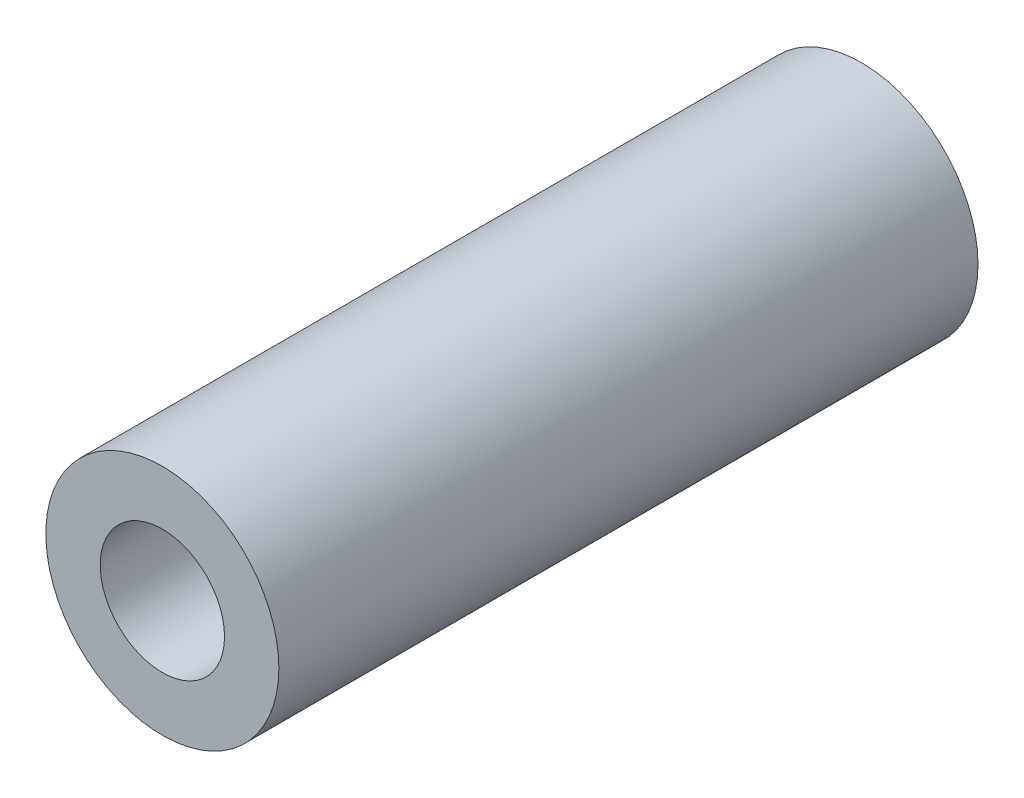
ISO-10303-21;
HEADER;
FILE_DESCRIPTION(('STEP AP214'),'2;1');
FILE_NAME('part.step','',(''),(''),'','','');
FILE_SCHEMA(('AUTOMOTIVE_DESIGN { 1 0 10303 214 1 1 1 1 }'));
ENDSEC;
DATA;
#1=APPLICATION_CONTEXT('core data for automotive mechanical design processes');
#2=APPLICATION_PROTOCOL_DEFINITION('international standard','automotive_design',2000,#1);
#3=PRODUCT_CONTEXT('',#1,'mechanical');
#4=PRODUCT('Part','Part','',(#3));
#5=PRODUCT_RELATED_PRODUCT_CATEGORY('part','',(#4));
#6=PRODUCT_DEFINITION_FORMATION('','',#4);
#7=PRODUCT_DEFINITION_CONTEXT('part definition',#1,'design');
#8=PRODUCT_DEFINITION('design','',#6,#7);
#9=PRODUCT_DEFINITION_SHAPE('','',#8);
#10=(LENGTH_UNIT() NAMED_UNIT(*) SI_UNIT(.MILLI.,.METRE.));
#11=(NAMED_UNIT(*) PLANE_ANGLE_UNIT() SI_UNIT($,.RADIAN.));
#12=(NAMED_UNIT(*) SI_UNIT($,.STERADIAN.) SOLID_ANGLE_UNIT());
#13=UNCERTAINTY_MEASURE_WITH_UNIT(LENGTH_MEASURE(1.E-05),#10,'distance_accuracy_value','');
#14=(GEOMETRIC_REPRESENTATION_CONTEXT(3) GLOBAL_UNCERTAINTY_ASSIGNED_CONTEXT((#13)) GLOBAL_UNIT_ASSIGNED_CONTEXT((#10,
#11,#12)) REPRESENTATION_CONTEXT('',''));
#15=CARTESIAN_POINT('',(0.,0.,0.));
#16=DIRECTION('',(0.,0.,1.));
#17=DIRECTION('',(1.,0.,0.));
#18=AXIS2_PLACEMENT_3D('',#15,#16,#17);
#19=CARTESIAN_POINT('',(0.,0.,18.));
#20=DIRECTION('',(0.,0.,1.));
#21=DIRECTION('',(1.,0.,0.));
#22=AXIS2_PLACEMENT_3D('',#19,#20,#21);
#23=PLANE('',#22);
#24=CARTESIAN_POINT('',(0.,0.,18.));
#25=DIRECTION('',(0.,0.,1.));
#26=DIRECTION('',(1.,0.,0.));
#27=AXIS2_PLACEMENT_3D('',#24,#25,#26);
#28=CIRCLE('',#27,3.);
#29=CARTESIAN_POINT('',(3.,0.,18.));
#30=VERTEX_POINT('',#29);
#31=EDGE_CURVE('E10',#30,#30,#28,.T.);
#32=ORIENTED_EDGE('',*,*,#31,.T.);
#33=EDGE_LOOP('',(#32));
#34=FACE_BOUND('',#33,.T.);
#35=CARTESIAN_POINT('',(0.,0.,18.));
#36=DIRECTION('',(0.,0.,1.));
#37=DIRECTION('',(1.,0.,0.));
#38=AXIS2_PLACEMENT_3D('',#35,#36,#37);
#39=CIRCLE('',#38,1.6);
#40=CARTESIAN_POINT('',(1.6,0.,18.));
#41=VERTEX_POINT('',#40);
#42=EDGE_CURVE('E45',#41,#41,#39,.T.);
#43=ORIENTED_EDGE('',*,*,#42,.F.);
#44=EDGE_LOOP('',(#43));
#45=FACE_BOUND('',#44,.T.);
#46=ADVANCED_FACE('F34',(#34,#45),#23,.T.);
#47=CARTESIAN_POINT('',(0.,0.,0.));
#48=DIRECTION('',(0.,0.,1.));
#49=DIRECTION('',(1.,0.,0.));
#50=AXIS2_PLACEMENT_3D('',#47,#48,#49);
#51=PLANE('',#50);
#52=CARTESIAN_POINT('',(0.,0.,0.));
#53=DIRECTION('',(0.,0.,1.));
#54=DIRECTION('',(1.,0.,0.));
#55=AXIS2_PLACEMENT_3D('',#52,#53,#54);
#56=CIRCLE('',#55,3.);
#57=CARTESIAN_POINT('',(3.,0.,0.));
#58=VERTEX_POINT('',#57);
#59=EDGE_CURVE('E38',#58,#58,#56,.T.);
#60=ORIENTED_EDGE('',*,*,#59,.F.);
#61=EDGE_LOOP('',(#60));
#62=FACE_BOUND('',#61,.T.);
#63=CARTESIAN_POINT('',(0.,0.,0.));
#64=DIRECTION('',(0.,0.,1.));
#65=DIRECTION('',(1.,0.,0.));
#66=AXIS2_PLACEMENT_3D('',#63,#64,#65);
#67=CIRCLE('',#66,1.6);
#68=CARTESIAN_POINT('',(1.6,0.,0.));
#69=VERTEX_POINT('',#68);
#70=EDGE_CURVE('E47',#69,#69,#67,.T.);
#71=ORIENTED_EDGE('',*,*,#70,.T.);
#72=EDGE_LOOP('',(#71));
#73=FACE_BOUND('',#72,.T.);
#74=ADVANCED_FACE('F57',(#62,#73),#51,.F.);
#75=CARTESIAN_POINT('',(0.,0.,18.));
#76=DIRECTION('',(0.,0.,-1.));
#77=DIRECTION('',(-1.,0.,0.));
#78=AXIS2_PLACEMENT_3D('',#75,#76,#77);
#79=CYLINDRICAL_SURFACE('',#78,3.);
#80=ORIENTED_EDGE('',*,*,#31,.F.);
#81=EDGE_LOOP('',(#80));
#82=FACE_BOUND('',#81,.T.);
#83=ORIENTED_EDGE('',*,*,#59,.T.);
#84=EDGE_LOOP('',(#83));
#85=FACE_BOUND('',#84,.T.);
#86=ADVANCED_FACE('F36',(#82,#85),#79,.T.);
#87=CARTESIAN_POINT('',(0.,0.,18.));
#88=DIRECTION('',(0.,0.,-1.));
#89=DIRECTION('',(-1.,0.,0.));
#90=AXIS2_PLACEMENT_3D('',#87,#88,#89);
#91=CYLINDRICAL_SURFACE('',#90,1.6);
#92=ORIENTED_EDGE('',*,*,#42,.T.);
#93=EDGE_LOOP('',(#92));
#94=FACE_BOUND('',#93,.T.);
#95=ORIENTED_EDGE('',*,*,#70,.F.);
#96=EDGE_LOOP('',(#95));
#97=FACE_BOUND('',#96,.T.);
#98=ADVANCED_FACE('F53',(#94,#97),#91,.F.);
#99=CLOSED_SHELL('',(#46,#74,#86,#98));
#100=MANIFOLD_SOLID_BREP('B2',#99);
#101=ADVANCED_BREP_SHAPE_REPRESENTATION('',(#18,#100),#14);
#102=SHAPE_DEFINITION_REPRESENTATION(#9,#101);
ENDSEC;
END-ISO-10303-21;
